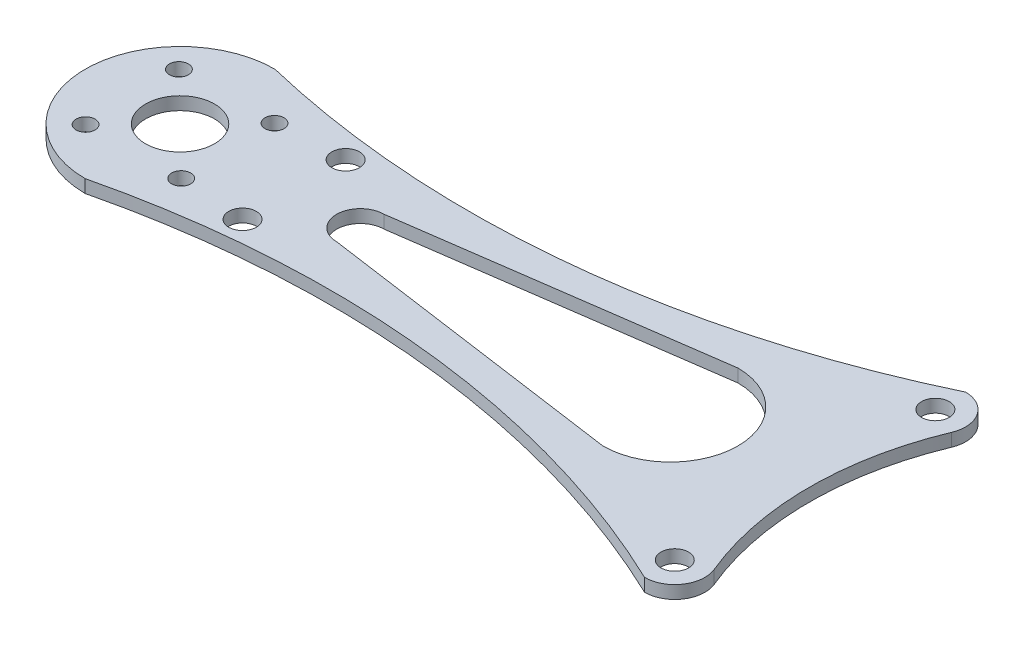
ISO-10303-21;
HEADER;
FILE_DESCRIPTION(('STEP AP214'),'2;1');
FILE_NAME('part.step','',(''),(''),'','','');
FILE_SCHEMA(('AUTOMOTIVE_DESIGN { 1 0 10303 214 1 1 1 1 }'));
ENDSEC;
DATA;
#1=APPLICATION_CONTEXT('core data for automotive mechanical design processes');
#2=APPLICATION_PROTOCOL_DEFINITION('international standard','automotive_design',2000,#1);
#3=PRODUCT_CONTEXT('',#1,'mechanical');
#4=PRODUCT('Part','Part','',(#3));
#5=PRODUCT_RELATED_PRODUCT_CATEGORY('part','',(#4));
#6=PRODUCT_DEFINITION_FORMATION('','',#4);
#7=PRODUCT_DEFINITION_CONTEXT('part definition',#1,'design');
#8=PRODUCT_DEFINITION('design','',#6,#7);
#9=PRODUCT_DEFINITION_SHAPE('','',#8);
#10=(LENGTH_UNIT() NAMED_UNIT(*) SI_UNIT(.MILLI.,.METRE.));
#11=(NAMED_UNIT(*) PLANE_ANGLE_UNIT() SI_UNIT($,.RADIAN.));
#12=(NAMED_UNIT(*) SI_UNIT($,.STERADIAN.) SOLID_ANGLE_UNIT());
#13=UNCERTAINTY_MEASURE_WITH_UNIT(LENGTH_MEASURE(1.E-05),#10,'distance_accuracy_value','');
#14=(GEOMETRIC_REPRESENTATION_CONTEXT(3) GLOBAL_UNCERTAINTY_ASSIGNED_CONTEXT((#13)) GLOBAL_UNIT_ASSIGNED_CONTEXT((#10,
#11,#12)) REPRESENTATION_CONTEXT('',''));
#15=CARTESIAN_POINT('',(0.,0.,0.));
#16=DIRECTION('',(0.,0.,1.));
#17=DIRECTION('',(1.,0.,0.));
#18=AXIS2_PLACEMENT_3D('',#15,#16,#17);
#19=CARTESIAN_POINT('',(-18.246620767098,0.75,7.55799778921041));
#20=DIRECTION('',(0.,1.,0.));
#21=DIRECTION('',(0.,0.,1.));
#22=AXIS2_PLACEMENT_3D('',#19,#20,#21);
#23=PLANE('',#22);
#24=CARTESIAN_POINT('',(-114.54591161256,0.75,-5.41344293270639));
#25=DIRECTION('',(0.,1.,0.));
#26=DIRECTION('',(0.,0.,1.));
#27=AXIS2_PLACEMENT_3D('',#24,#25,#26);
#28=CIRCLE('',#27,1.10000000000002);
#29=CARTESIAN_POINT('',(-114.54591161256,0.75,-4.31344293270637));
#30=VERTEX_POINT('',#29);
#31=EDGE_CURVE('E312',#30,#30,#28,.T.);
#32=ORIENTED_EDGE('',*,*,#31,.F.);
#33=EDGE_LOOP('',(#32));
#34=FACE_BOUND('',#33,.T.);
#35=CARTESIAN_POINT('',(-114.413442932706,0.75,5.54591161256024));
#36=DIRECTION('',(0.,1.,0.));
#37=DIRECTION('',(0.,0.,1.));
#38=AXIS2_PLACEMENT_3D('',#35,#36,#37);
#39=CIRCLE('',#38,1.10000000000001);
#40=CARTESIAN_POINT('',(-114.413442932706,0.75,6.64591161256025));
#41=VERTEX_POINT('',#40);
#42=EDGE_CURVE('E316',#41,#41,#39,.T.);
#43=ORIENTED_EDGE('',*,*,#42,.F.);
#44=EDGE_LOOP('',(#43));
#45=FACE_BOUND('',#44,.T.);
#46=CARTESIAN_POINT('',(-103.45408838744,0.75,5.41344293270657));
#47=DIRECTION('',(0.,1.,0.));
#48=DIRECTION('',(0.,0.,1.));
#49=AXIS2_PLACEMENT_3D('',#46,#47,#48);
#50=CIRCLE('',#49,1.1);
#51=CARTESIAN_POINT('',(-103.45408838744,0.75,6.51344293270658));
#52=VERTEX_POINT('',#51);
#53=EDGE_CURVE('E325',#52,#52,#50,.T.);
#54=ORIENTED_EDGE('',*,*,#53,.F.);
#55=EDGE_LOOP('',(#54));
#56=FACE_BOUND('',#55,.T.);
#57=CARTESIAN_POINT('',(-103.586557067293,0.75,-5.54591161256014));
#58=DIRECTION('',(0.,1.,0.));
#59=DIRECTION('',(0.,0.,1.));
#60=AXIS2_PLACEMENT_3D('',#57,#58,#59);
#61=CIRCLE('',#60,1.10000000000001);
#62=CARTESIAN_POINT('',(-103.586557067293,0.75,-4.44591161256013));
#63=VERTEX_POINT('',#62);
#64=EDGE_CURVE('E331',#63,#63,#61,.T.);
#65=ORIENTED_EDGE('',*,*,#64,.F.);
#66=EDGE_LOOP('',(#65));
#67=FACE_BOUND('',#66,.T.);
#68=CARTESIAN_POINT('',(-88.0784459485142,0.75,0.));
#69=DIRECTION('',(0.,1.,0.));
#70=DIRECTION('',(0.,0.,1.));
#71=AXIS2_PLACEMENT_3D('',#68,#69,#70);
#72=CIRCLE('',#71,2.75757742414673);
#73=CARTESIAN_POINT('',(-88.0784459485142,0.75,-2.75757742414675));
#74=VERTEX_POINT('',#73);
#75=CARTESIAN_POINT('',(-88.0784459485142,0.75,2.75757742414671));
#76=VERTEX_POINT('',#75);
#77=EDGE_CURVE('E48',#74,#76,#72,.T.);
#78=ORIENTED_EDGE('',*,*,#77,.F.);
#79=DIRECTION('',(-0.990191024034519,0.,0.139720205845361));
#80=VECTOR('',#79,1.);
#81=CARTESIAN_POINT('',(-88.0784459485142,0.75,-2.75757742414675));
#82=LINE('',#81,#80);
#83=CARTESIAN_POINT('',(-52.1196363376409,0.75,-7.83151988457672));
#84=VERTEX_POINT('',#83);
#85=EDGE_CURVE('E118',#84,#74,#82,.T.);
#86=ORIENTED_EDGE('',*,*,#85,.F.);
#87=CARTESIAN_POINT('',(-52.1196363376409,0.75,0.));
#88=DIRECTION('',(0.,1.,0.));
#89=DIRECTION('',(0.,0.,1.));
#90=AXIS2_PLACEMENT_3D('',#87,#88,#89);
#91=CIRCLE('',#90,7.8315198845767);
#92=CARTESIAN_POINT('',(-52.1196363376409,0.75,7.83151988457668));
#93=VERTEX_POINT('',#92);
#94=EDGE_CURVE('E138',#93,#84,#91,.T.);
#95=ORIENTED_EDGE('',*,*,#94,.F.);
#96=DIRECTION('',(0.990191024034519,0.,0.139720205845361));
#97=VECTOR('',#96,1.);
#98=CARTESIAN_POINT('',(-88.0784459485142,0.75,2.75757742414671));
#99=LINE('',#98,#97);
#100=EDGE_CURVE('E132',#76,#93,#99,.T.);
#101=ORIENTED_EDGE('',*,*,#100,.F.);
#102=EDGE_LOOP('',(#78,#86,#95,#101));
#103=FACE_BOUND('',#102,.T.);
#104=CARTESIAN_POINT('',(-109.,0.75,0.));
#105=DIRECTION('',(0.,1.,0.));
#106=DIRECTION('',(0.,0.,1.));
#107=AXIS2_PLACEMENT_3D('',#104,#105,#106);
#108=CIRCLE('',#107,4.00000000000001);
#109=CARTESIAN_POINT('',(-109.,0.75,4.00000000000001));
#110=VERTEX_POINT('',#109);
#111=EDGE_CURVE('E124',#110,#110,#108,.T.);
#112=ORIENTED_EDGE('',*,*,#111,.F.);
#113=EDGE_LOOP('',(#112));
#114=FACE_BOUND('',#113,.T.);
#115=CARTESIAN_POINT('',(-95.79,0.75,5.96));
#116=DIRECTION('',(0.,1.,0.));
#117=DIRECTION('',(0.,0.,1.));
#118=AXIS2_PLACEMENT_3D('',#115,#116,#117);
#119=CIRCLE('',#118,1.60000000000001);
#120=CARTESIAN_POINT('',(-95.79,0.75,7.56));
#121=VERTEX_POINT('',#120);
#122=EDGE_CURVE('E159',#121,#121,#119,.T.);
#123=ORIENTED_EDGE('',*,*,#122,.F.);
#124=EDGE_LOOP('',(#123));
#125=FACE_BOUND('',#124,.T.);
#126=CARTESIAN_POINT('',(-36.4932415341959,0.75,-15.1159955784208));
#127=DIRECTION('',(0.,1.,0.));
#128=DIRECTION('',(0.,0.,1.));
#129=AXIS2_PLACEMENT_3D('',#126,#127,#128);
#130=CIRCLE('',#129,1.6);
#131=CARTESIAN_POINT('',(-36.4932415341959,0.75,-13.5159955784208));
#132=VERTEX_POINT('',#131);
#133=EDGE_CURVE('E171',#132,#132,#130,.T.);
#134=ORIENTED_EDGE('',*,*,#133,.F.);
#135=EDGE_LOOP('',(#134));
#136=FACE_BOUND('',#135,.T.);
#137=CARTESIAN_POINT('',(-36.4932415341959,0.75,15.1159955784208));
#138=DIRECTION('',(0.,1.,0.));
#139=DIRECTION('',(0.,0.,1.));
#140=AXIS2_PLACEMENT_3D('',#137,#138,#139);
#141=CIRCLE('',#140,3.50000000000001);
#142=CARTESIAN_POINT('',(-36.4932415341959,0.75,18.6159955784208));
#143=VERTEX_POINT('',#142);
#144=CARTESIAN_POINT('',(-33.2596631704064,0.75,13.776603565143));
#145=VERTEX_POINT('',#144);
#146=EDGE_CURVE('E177',#143,#145,#141,.T.);
#147=ORIENTED_EDGE('',*,*,#146,.T.);
#148=CARTESIAN_POINT('',(0.,0.75,0.));
#149=DIRECTION('',(0.,-1.,0.));
#150=DIRECTION('',(0.,0.,1.));
#151=AXIS2_PLACEMENT_3D('',#148,#149,#150);
#152=CIRCLE('',#151,36.);
#153=CARTESIAN_POINT('',(-33.2596631704064,0.75,-13.776603565143));
#154=VERTEX_POINT('',#153);
#155=EDGE_CURVE('E180',#145,#154,#152,.T.);
#156=ORIENTED_EDGE('',*,*,#155,.T.);
#157=CARTESIAN_POINT('',(-36.4932415341959,0.75,-15.1159955784208));
#158=DIRECTION('',(0.,1.,0.));
#159=DIRECTION('',(0.,0.,1.));
#160=AXIS2_PLACEMENT_3D('',#157,#158,#159);
#161=CIRCLE('',#160,3.5);
#162=CARTESIAN_POINT('',(-36.4932415341959,0.75,-18.6159955784208));
#163=VERTEX_POINT('',#162);
#164=EDGE_CURVE('E183',#154,#163,#161,.T.);
#165=ORIENTED_EDGE('',*,*,#164,.T.);
#166=CARTESIAN_POINT('',(-83.4775380681395,0.75,-116.969825596425));
#167=DIRECTION('',(0.,-1.,0.));
#168=DIRECTION('',(0.,0.,1.));
#169=AXIS2_PLACEMENT_3D('',#166,#167,#168);
#170=CIRCLE('',#169,109.);
#171=CARTESIAN_POINT('',(-109.,0.75,-11.));
#172=VERTEX_POINT('',#171);
#173=EDGE_CURVE('E185',#163,#172,#170,.T.);
#174=ORIENTED_EDGE('',*,*,#173,.T.);
#175=CARTESIAN_POINT('',(-109.,0.75,0.));
#176=DIRECTION('',(0.,1.,0.));
#177=DIRECTION('',(0.,0.,1.));
#178=AXIS2_PLACEMENT_3D('',#175,#176,#177);
#179=CIRCLE('',#178,11.);
#180=CARTESIAN_POINT('',(-109.,0.75,11.));
#181=VERTEX_POINT('',#180);
#182=EDGE_CURVE('E187',#172,#181,#179,.T.);
#183=ORIENTED_EDGE('',*,*,#182,.T.);
#184=CARTESIAN_POINT('',(-83.4775380681395,0.75,116.969825596425));
#185=DIRECTION('',(0.,-1.,0.));
#186=DIRECTION('',(0.,0.,-1.));
#187=AXIS2_PLACEMENT_3D('',#184,#185,#186);
#188=CIRCLE('',#187,109.);
#189=EDGE_CURVE('E189',#181,#143,#188,.T.);
#190=ORIENTED_EDGE('',*,*,#189,.T.);
#191=EDGE_LOOP('',(#147,#156,#165,#174,#183,#190));
#192=FACE_BOUND('',#191,.T.);
#193=CARTESIAN_POINT('',(-36.4932415341959,0.75,15.1159955784208));
#194=DIRECTION('',(0.,1.,0.));
#195=DIRECTION('',(0.,0.,1.));
#196=AXIS2_PLACEMENT_3D('',#193,#194,#195);
#197=CIRCLE('',#196,1.6);
#198=CARTESIAN_POINT('',(-36.4932415341959,0.75,16.7159955784208));
#199=VERTEX_POINT('',#198);
#200=EDGE_CURVE('E165',#199,#199,#197,.T.);
#201=ORIENTED_EDGE('',*,*,#200,.F.);
#202=EDGE_LOOP('',(#201));
#203=FACE_BOUND('',#202,.T.);
#204=CARTESIAN_POINT('',(-95.79,0.75,-6.));
#205=DIRECTION('',(0.,1.,0.));
#206=DIRECTION('',(0.,0.,1.));
#207=AXIS2_PLACEMENT_3D('',#204,#205,#206);
#208=CIRCLE('',#207,1.60000000000001);
#209=CARTESIAN_POINT('',(-95.79,0.75,-4.4));
#210=VERTEX_POINT('',#209);
#211=EDGE_CURVE('E153',#210,#210,#208,.T.);
#212=ORIENTED_EDGE('',*,*,#211,.F.);
#213=EDGE_LOOP('',(#212));
#214=FACE_BOUND('',#213,.T.);
#215=ADVANCED_FACE('F33',(#34,#45,#56,#67,#103,#114,#125,#136,#192,#203,#214),#23,.T.);
#216=CARTESIAN_POINT('',(-18.246620767098,-0.75,7.55799778921041));
#217=DIRECTION('',(0.,1.,0.));
#218=DIRECTION('',(0.,0.,1.));
#219=AXIS2_PLACEMENT_3D('',#216,#217,#218);
#220=PLANE('',#219);
#221=CARTESIAN_POINT('',(-114.54591161256,-0.75,-5.41344293270639));
#222=DIRECTION('',(0.,1.,0.));
#223=DIRECTION('',(0.,0.,1.));
#224=AXIS2_PLACEMENT_3D('',#221,#222,#223);
#225=CIRCLE('',#224,1.10000000000002);
#226=CARTESIAN_POINT('',(-114.54591161256,-0.75,-4.31344293270637));
#227=VERTEX_POINT('',#226);
#228=EDGE_CURVE('E315',#227,#227,#225,.F.);
#229=ORIENTED_EDGE('',*,*,#228,.F.);
#230=EDGE_LOOP('',(#229));
#231=FACE_BOUND('',#230,.T.);
#232=CARTESIAN_POINT('',(-114.413442932706,-0.75,5.54591161256024));
#233=DIRECTION('',(0.,1.,0.));
#234=DIRECTION('',(0.,0.,1.));
#235=AXIS2_PLACEMENT_3D('',#232,#233,#234);
#236=CIRCLE('',#235,1.10000000000001);
#237=CARTESIAN_POINT('',(-114.413442932706,-0.75,6.64591161256025));
#238=VERTEX_POINT('',#237);
#239=EDGE_CURVE('E319',#238,#238,#236,.F.);
#240=ORIENTED_EDGE('',*,*,#239,.F.);
#241=EDGE_LOOP('',(#240));
#242=FACE_BOUND('',#241,.T.);
#243=CARTESIAN_POINT('',(-103.45408838744,-0.75,5.41344293270657));
#244=DIRECTION('',(0.,1.,0.));
#245=DIRECTION('',(0.,0.,1.));
#246=AXIS2_PLACEMENT_3D('',#243,#244,#245);
#247=CIRCLE('',#246,1.1);
#248=CARTESIAN_POINT('',(-103.45408838744,-0.75,6.51344293270658));
#249=VERTEX_POINT('',#248);
#250=EDGE_CURVE('E328',#249,#249,#247,.F.);
#251=ORIENTED_EDGE('',*,*,#250,.F.);
#252=EDGE_LOOP('',(#251));
#253=FACE_BOUND('',#252,.T.);
#254=CARTESIAN_POINT('',(-103.586557067293,-0.75,-5.54591161256014));
#255=DIRECTION('',(0.,1.,0.));
#256=DIRECTION('',(0.,0.,1.));
#257=AXIS2_PLACEMENT_3D('',#254,#255,#256);
#258=CIRCLE('',#257,1.10000000000001);
#259=CARTESIAN_POINT('',(-103.586557067293,-0.75,-4.44591161256013));
#260=VERTEX_POINT('',#259);
#261=EDGE_CURVE('E334',#260,#260,#258,.F.);
#262=ORIENTED_EDGE('',*,*,#261,.F.);
#263=EDGE_LOOP('',(#262));
#264=FACE_BOUND('',#263,.T.);
#265=DIRECTION('',(0.990191024034519,0.,-0.139720205845361));
#266=VECTOR('',#265,1.);
#267=CARTESIAN_POINT('',(-88.0784459485142,-0.75,-2.75757742414675));
#268=LINE('',#267,#266);
#269=CARTESIAN_POINT('',(-88.0784459485142,-0.75,-2.75757742414675));
#270=VERTEX_POINT('',#269);
#271=CARTESIAN_POINT('',(-52.1196363376409,-0.75,-7.83151988457672));
#272=VERTEX_POINT('',#271);
#273=EDGE_CURVE('E130',#270,#272,#268,.T.);
#274=ORIENTED_EDGE('',*,*,#273,.F.);
#275=CARTESIAN_POINT('',(-88.0784459485142,-0.75,0.));
#276=DIRECTION('',(0.,1.,0.));
#277=DIRECTION('',(0.,0.,1.));
#278=AXIS2_PLACEMENT_3D('',#275,#276,#277);
#279=CIRCLE('',#278,2.75757742414673);
#280=CARTESIAN_POINT('',(-88.0784459485142,-0.75,2.75757742414671));
#281=VERTEX_POINT('',#280);
#282=EDGE_CURVE('E112',#281,#270,#279,.F.);
#283=ORIENTED_EDGE('',*,*,#282,.F.);
#284=DIRECTION('',(-0.990191024034519,0.,-0.139720205845361));
#285=VECTOR('',#284,1.);
#286=CARTESIAN_POINT('',(-88.0784459485142,-0.75,2.75757742414671));
#287=LINE('',#286,#285);
#288=CARTESIAN_POINT('',(-52.1196363376409,-0.75,7.83151988457668));
#289=VERTEX_POINT('',#288);
#290=EDGE_CURVE('E121',#289,#281,#287,.T.);
#291=ORIENTED_EDGE('',*,*,#290,.F.);
#292=CARTESIAN_POINT('',(-52.1196363376409,-0.75,0.));
#293=DIRECTION('',(0.,1.,0.));
#294=DIRECTION('',(0.,0.,1.));
#295=AXIS2_PLACEMENT_3D('',#292,#293,#294);
#296=CIRCLE('',#295,7.8315198845767);
#297=EDGE_CURVE('E56',#272,#289,#296,.F.);
#298=ORIENTED_EDGE('',*,*,#297,.F.);
#299=EDGE_LOOP('',(#274,#283,#291,#298));
#300=FACE_BOUND('',#299,.T.);
#301=CARTESIAN_POINT('',(-109.,-0.75,0.));
#302=DIRECTION('',(0.,1.,0.));
#303=DIRECTION('',(0.,0.,1.));
#304=AXIS2_PLACEMENT_3D('',#301,#302,#303);
#305=CIRCLE('',#304,4.00000000000001);
#306=CARTESIAN_POINT('',(-109.,-0.75,4.00000000000001));
#307=VERTEX_POINT('',#306);
#308=EDGE_CURVE('E149',#307,#307,#305,.F.);
#309=ORIENTED_EDGE('',*,*,#308,.F.);
#310=EDGE_LOOP('',(#309));
#311=FACE_BOUND('',#310,.T.);
#312=CARTESIAN_POINT('',(-95.79,-0.75,5.96));
#313=DIRECTION('',(0.,1.,0.));
#314=DIRECTION('',(0.,0.,1.));
#315=AXIS2_PLACEMENT_3D('',#312,#313,#314);
#316=CIRCLE('',#315,1.60000000000001);
#317=CARTESIAN_POINT('',(-95.79,-0.75,7.56));
#318=VERTEX_POINT('',#317);
#319=EDGE_CURVE('E156',#318,#318,#316,.T.);
#320=ORIENTED_EDGE('',*,*,#319,.T.);
#321=EDGE_LOOP('',(#320));
#322=FACE_BOUND('',#321,.T.);
#323=CARTESIAN_POINT('',(-36.4932415341959,-0.75,-15.1159955784208));
#324=DIRECTION('',(0.,1.,0.));
#325=DIRECTION('',(0.,0.,1.));
#326=AXIS2_PLACEMENT_3D('',#323,#324,#325);
#327=CIRCLE('',#326,1.6);
#328=CARTESIAN_POINT('',(-36.4932415341959,-0.75,-13.5159955784208));
#329=VERTEX_POINT('',#328);
#330=EDGE_CURVE('E168',#329,#329,#327,.T.);
#331=ORIENTED_EDGE('',*,*,#330,.T.);
#332=EDGE_LOOP('',(#331));
#333=FACE_BOUND('',#332,.T.);
#334=CARTESIAN_POINT('',(-36.4932415341959,-0.75,15.1159955784208));
#335=DIRECTION('',(0.,1.,0.));
#336=DIRECTION('',(0.,0.,1.));
#337=AXIS2_PLACEMENT_3D('',#334,#335,#336);
#338=CIRCLE('',#337,3.50000000000001);
#339=CARTESIAN_POINT('',(-36.4932415341959,-0.75,18.6159955784208));
#340=VERTEX_POINT('',#339);
#341=CARTESIAN_POINT('',(-33.2596631704064,-0.75,13.776603565143));
#342=VERTEX_POINT('',#341);
#343=EDGE_CURVE('E174',#340,#342,#338,.T.);
#344=ORIENTED_EDGE('',*,*,#343,.F.);
#345=CARTESIAN_POINT('',(-83.4775380681395,-0.75,116.969825596425));
#346=DIRECTION('',(0.,-1.,0.));
#347=DIRECTION('',(0.,0.,-1.));
#348=AXIS2_PLACEMENT_3D('',#345,#346,#347);
#349=CIRCLE('',#348,109.);
#350=CARTESIAN_POINT('',(-109.,-0.75,11.));
#351=VERTEX_POINT('',#350);
#352=EDGE_CURVE('E181',#351,#340,#349,.T.);
#353=ORIENTED_EDGE('',*,*,#352,.F.);
#354=CARTESIAN_POINT('',(-109.,-0.75,0.));
#355=DIRECTION('',(0.,1.,0.));
#356=DIRECTION('',(0.,0.,1.));
#357=AXIS2_PLACEMENT_3D('',#354,#355,#356);
#358=CIRCLE('',#357,11.);
#359=CARTESIAN_POINT('',(-109.,-0.75,-11.));
#360=VERTEX_POINT('',#359);
#361=EDGE_CURVE('E200',#360,#351,#358,.T.);
#362=ORIENTED_EDGE('',*,*,#361,.F.);
#363=CARTESIAN_POINT('',(-83.4775380681395,-0.75,-116.969825596425));
#364=DIRECTION('',(0.,-1.,0.));
#365=DIRECTION('',(0.,0.,1.));
#366=AXIS2_PLACEMENT_3D('',#363,#364,#365);
#367=CIRCLE('',#366,109.);
#368=CARTESIAN_POINT('',(-36.4932415341959,-0.75,-18.6159955784208));
#369=VERTEX_POINT('',#368);
#370=EDGE_CURVE('E198',#369,#360,#367,.T.);
#371=ORIENTED_EDGE('',*,*,#370,.F.);
#372=CARTESIAN_POINT('',(-36.4932415341959,-0.75,-15.1159955784208));
#373=DIRECTION('',(0.,1.,0.));
#374=DIRECTION('',(0.,0.,1.));
#375=AXIS2_PLACEMENT_3D('',#372,#373,#374);
#376=CIRCLE('',#375,3.5);
#377=CARTESIAN_POINT('',(-33.2596631704064,-0.75,-13.776603565143));
#378=VERTEX_POINT('',#377);
#379=EDGE_CURVE('E196',#378,#369,#376,.T.);
#380=ORIENTED_EDGE('',*,*,#379,.F.);
#381=CARTESIAN_POINT('',(0.,-0.75,0.));
#382=DIRECTION('',(0.,-1.,0.));
#383=DIRECTION('',(0.,0.,1.));
#384=AXIS2_PLACEMENT_3D('',#381,#382,#383);
#385=CIRCLE('',#384,36.);
#386=EDGE_CURVE('E194',#342,#378,#385,.T.);
#387=ORIENTED_EDGE('',*,*,#386,.F.);
#388=EDGE_LOOP('',(#344,#353,#362,#371,#380,#387));
#389=FACE_BOUND('',#388,.T.);
#390=CARTESIAN_POINT('',(-36.4932415341959,-0.75,15.1159955784208));
#391=DIRECTION('',(0.,1.,0.));
#392=DIRECTION('',(0.,0.,1.));
#393=AXIS2_PLACEMENT_3D('',#390,#391,#392);
#394=CIRCLE('',#393,1.6);
#395=CARTESIAN_POINT('',(-36.4932415341959,-0.75,16.7159955784208));
#396=VERTEX_POINT('',#395);
#397=EDGE_CURVE('E162',#396,#396,#394,.T.);
#398=ORIENTED_EDGE('',*,*,#397,.T.);
#399=EDGE_LOOP('',(#398));
#400=FACE_BOUND('',#399,.T.);
#401=CARTESIAN_POINT('',(-95.79,-0.75,-6.));
#402=DIRECTION('',(0.,1.,0.));
#403=DIRECTION('',(0.,0.,1.));
#404=AXIS2_PLACEMENT_3D('',#401,#402,#403);
#405=CIRCLE('',#404,1.60000000000001);
#406=CARTESIAN_POINT('',(-95.79,-0.75,-4.4));
#407=VERTEX_POINT('',#406);
#408=EDGE_CURVE('E152',#407,#407,#405,.T.);
#409=ORIENTED_EDGE('',*,*,#408,.T.);
#410=EDGE_LOOP('',(#409));
#411=FACE_BOUND('',#410,.T.);
#412=ADVANCED_FACE('F127',(#231,#242,#253,#264,#300,#311,#322,#333,#389,#400,#411),#220,.F.);
#413=CARTESIAN_POINT('',(-36.4932415341959,0.75,15.1159955784208));
#414=DIRECTION('',(0.,-1.,0.));
#415=DIRECTION('',(0.,0.,-1.));
#416=AXIS2_PLACEMENT_3D('',#413,#414,#415);
#417=CYLINDRICAL_SURFACE('',#416,3.50000000000001);
#418=ORIENTED_EDGE('',*,*,#343,.T.);
#419=DIRECTION('',(0.,-1.,0.));
#420=VECTOR('',#419,1.);
#421=CARTESIAN_POINT('',(-33.2596631704064,0.75,13.776603565143));
#422=LINE('',#421,#420);
#423=EDGE_CURVE('E11',#145,#342,#422,.T.);
#424=ORIENTED_EDGE('',*,*,#423,.F.);
#425=ORIENTED_EDGE('',*,*,#146,.F.);
#426=DIRECTION('',(0.,-1.,0.));
#427=VECTOR('',#426,1.);
#428=CARTESIAN_POINT('',(-36.4932415341959,0.75,18.6159955784208));
#429=LINE('',#428,#427);
#430=EDGE_CURVE('E191',#143,#340,#429,.T.);
#431=ORIENTED_EDGE('',*,*,#430,.T.);
#432=EDGE_LOOP('',(#418,#424,#425,#431));
#433=FACE_BOUND('',#432,.T.);
#434=ADVANCED_FACE('F35',(#433),#417,.T.);
#435=CARTESIAN_POINT('',(0.,0.75,0.));
#436=DIRECTION('',(0.,-1.,0.));
#437=DIRECTION('',(0.,0.,-1.));
#438=AXIS2_PLACEMENT_3D('',#435,#436,#437);
#439=CYLINDRICAL_SURFACE('',#438,36.);
#440=ORIENTED_EDGE('',*,*,#386,.T.);
#441=DIRECTION('',(0.,-1.,0.));
#442=VECTOR('',#441,1.);
#443=CARTESIAN_POINT('',(-33.2596631704064,0.75,-13.776603565143));
#444=LINE('',#443,#442);
#445=EDGE_CURVE('E41',#154,#378,#444,.T.);
#446=ORIENTED_EDGE('',*,*,#445,.F.);
#447=ORIENTED_EDGE('',*,*,#155,.F.);
#448=ORIENTED_EDGE('',*,*,#423,.T.);
#449=EDGE_LOOP('',(#440,#446,#447,#448));
#450=FACE_BOUND('',#449,.T.);
#451=ADVANCED_FACE('F241',(#450),#439,.F.);
#452=CARTESIAN_POINT('',(-36.4932415341959,0.75,-15.1159955784208));
#453=DIRECTION('',(0.,-1.,0.));
#454=DIRECTION('',(0.,0.,-1.));
#455=AXIS2_PLACEMENT_3D('',#452,#453,#454);
#456=CYLINDRICAL_SURFACE('',#455,3.5);
#457=ORIENTED_EDGE('',*,*,#379,.T.);
#458=DIRECTION('',(0.,-1.,0.));
#459=VECTOR('',#458,1.);
#460=CARTESIAN_POINT('',(-36.4932415341959,0.75,-18.6159955784208));
#461=LINE('',#460,#459);
#462=EDGE_CURVE('E211',#163,#369,#461,.T.);
#463=ORIENTED_EDGE('',*,*,#462,.F.);
#464=ORIENTED_EDGE('',*,*,#164,.F.);
#465=ORIENTED_EDGE('',*,*,#445,.T.);
#466=EDGE_LOOP('',(#457,#463,#464,#465));
#467=FACE_BOUND('',#466,.T.);
#468=ADVANCED_FACE('F218',(#467),#456,.T.);
#469=CARTESIAN_POINT('',(-83.4775380681395,0.75,-116.969825596425));
#470=DIRECTION('',(0.,-1.,0.));
#471=DIRECTION('',(0.,0.,-1.));
#472=AXIS2_PLACEMENT_3D('',#469,#470,#471);
#473=CYLINDRICAL_SURFACE('',#472,109.);
#474=ORIENTED_EDGE('',*,*,#370,.T.);
#475=DIRECTION('',(0.,-1.,0.));
#476=VECTOR('',#475,1.);
#477=CARTESIAN_POINT('',(-109.,0.75,-11.));
#478=LINE('',#477,#476);
#479=EDGE_CURVE('E208',#172,#360,#478,.T.);
#480=ORIENTED_EDGE('',*,*,#479,.F.);
#481=ORIENTED_EDGE('',*,*,#173,.F.);
#482=ORIENTED_EDGE('',*,*,#462,.T.);
#483=EDGE_LOOP('',(#474,#480,#481,#482));
#484=FACE_BOUND('',#483,.T.);
#485=ADVANCED_FACE('F229',(#484),#473,.F.);
#486=CARTESIAN_POINT('',(-109.,0.75,0.));
#487=DIRECTION('',(0.,-1.,0.));
#488=DIRECTION('',(0.,0.,-1.));
#489=AXIS2_PLACEMENT_3D('',#486,#487,#488);
#490=CYLINDRICAL_SURFACE('',#489,11.);
#491=ORIENTED_EDGE('',*,*,#361,.T.);
#492=DIRECTION('',(0.,-1.,0.));
#493=VECTOR('',#492,1.);
#494=CARTESIAN_POINT('',(-109.,0.75,11.));
#495=LINE('',#494,#493);
#496=EDGE_CURVE('E205',#181,#351,#495,.T.);
#497=ORIENTED_EDGE('',*,*,#496,.F.);
#498=ORIENTED_EDGE('',*,*,#182,.F.);
#499=ORIENTED_EDGE('',*,*,#479,.T.);
#500=EDGE_LOOP('',(#491,#497,#498,#499));
#501=FACE_BOUND('',#500,.T.);
#502=ADVANCED_FACE('F233',(#501),#490,.T.);
#503=CARTESIAN_POINT('',(-83.4775380681395,0.75,116.969825596425));
#504=DIRECTION('',(0.,-1.,0.));
#505=DIRECTION('',(0.,0.,-1.));
#506=AXIS2_PLACEMENT_3D('',#503,#504,#505);
#507=CYLINDRICAL_SURFACE('',#506,109.);
#508=ORIENTED_EDGE('',*,*,#352,.T.);
#509=ORIENTED_EDGE('',*,*,#430,.F.);
#510=ORIENTED_EDGE('',*,*,#189,.F.);
#511=ORIENTED_EDGE('',*,*,#496,.T.);
#512=EDGE_LOOP('',(#508,#509,#510,#511));
#513=FACE_BOUND('',#512,.T.);
#514=ADVANCED_FACE('F244',(#513),#507,.F.);
#515=CARTESIAN_POINT('',(-36.4932415341959,0.75,-15.1159955784208));
#516=DIRECTION('',(0.,-1.,0.));
#517=DIRECTION('',(0.,0.,-1.));
#518=AXIS2_PLACEMENT_3D('',#515,#516,#517);
#519=CYLINDRICAL_SURFACE('',#518,1.6);
#520=ORIENTED_EDGE('',*,*,#133,.T.);
#521=EDGE_LOOP('',(#520));
#522=FACE_BOUND('',#521,.T.);
#523=ORIENTED_EDGE('',*,*,#330,.F.);
#524=EDGE_LOOP('',(#523));
#525=FACE_BOUND('',#524,.T.);
#526=ADVANCED_FACE('F246',(#522,#525),#519,.F.);
#527=CARTESIAN_POINT('',(-36.4932415341959,0.75,15.1159955784208));
#528=DIRECTION('',(0.,-1.,0.));
#529=DIRECTION('',(0.,0.,-1.));
#530=AXIS2_PLACEMENT_3D('',#527,#528,#529);
#531=CYLINDRICAL_SURFACE('',#530,1.6);
#532=ORIENTED_EDGE('',*,*,#200,.T.);
#533=EDGE_LOOP('',(#532));
#534=FACE_BOUND('',#533,.T.);
#535=ORIENTED_EDGE('',*,*,#397,.F.);
#536=EDGE_LOOP('',(#535));
#537=FACE_BOUND('',#536,.T.);
#538=ADVANCED_FACE('F252',(#534,#537),#531,.F.);
#539=CARTESIAN_POINT('',(-95.79,0.75,5.96));
#540=DIRECTION('',(0.,-1.,0.));
#541=DIRECTION('',(0.,0.,-1.));
#542=AXIS2_PLACEMENT_3D('',#539,#540,#541);
#543=CYLINDRICAL_SURFACE('',#542,1.60000000000001);
#544=ORIENTED_EDGE('',*,*,#122,.T.);
#545=EDGE_LOOP('',(#544));
#546=FACE_BOUND('',#545,.T.);
#547=ORIENTED_EDGE('',*,*,#319,.F.);
#548=EDGE_LOOP('',(#547));
#549=FACE_BOUND('',#548,.T.);
#550=ADVANCED_FACE('F269',(#546,#549),#543,.F.);
#551=CARTESIAN_POINT('',(-95.79,0.75,-6.));
#552=DIRECTION('',(0.,-1.,0.));
#553=DIRECTION('',(0.,0.,-1.));
#554=AXIS2_PLACEMENT_3D('',#551,#552,#553);
#555=CYLINDRICAL_SURFACE('',#554,1.60000000000001);
#556=ORIENTED_EDGE('',*,*,#211,.T.);
#557=EDGE_LOOP('',(#556));
#558=FACE_BOUND('',#557,.T.);
#559=ORIENTED_EDGE('',*,*,#408,.F.);
#560=EDGE_LOOP('',(#559));
#561=FACE_BOUND('',#560,.T.);
#562=ADVANCED_FACE('F273',(#558,#561),#555,.F.);
#563=CARTESIAN_POINT('',(-109.,-0.751,0.));
#564=DIRECTION('',(0.,1.,0.));
#565=DIRECTION('',(0.,0.,1.));
#566=AXIS2_PLACEMENT_3D('',#563,#564,#565);
#567=CYLINDRICAL_SURFACE('',#566,4.00000000000001);
#568=ORIENTED_EDGE('',*,*,#111,.T.);
#569=EDGE_LOOP('',(#568));
#570=FACE_BOUND('',#569,.T.);
#571=ORIENTED_EDGE('',*,*,#308,.T.);
#572=EDGE_LOOP('',(#571));
#573=FACE_BOUND('',#572,.T.);
#574=ADVANCED_FACE('F277',(#570,#573),#567,.F.);
#575=CARTESIAN_POINT('',(-88.0784459485142,-0.751,0.));
#576=DIRECTION('',(0.,1.,0.));
#577=DIRECTION('',(0.,0.,1.));
#578=AXIS2_PLACEMENT_3D('',#575,#576,#577);
#579=CYLINDRICAL_SURFACE('',#578,2.75757742414673);
#580=ORIENTED_EDGE('',*,*,#282,.T.);
#581=DIRECTION('',(0.,1.,0.));
#582=VECTOR('',#581,1.);
#583=CARTESIAN_POINT('',(-88.0784459485142,-0.751,-2.75757742414675));
#584=LINE('',#583,#582);
#585=EDGE_CURVE('E125',#270,#74,#584,.T.);
#586=ORIENTED_EDGE('',*,*,#585,.T.);
#587=ORIENTED_EDGE('',*,*,#77,.T.);
#588=DIRECTION('',(0.,1.,0.));
#589=VECTOR('',#588,1.);
#590=CARTESIAN_POINT('',(-88.0784459485142,-0.751,2.75757742414671));
#591=LINE('',#590,#589);
#592=EDGE_CURVE('E108',#281,#76,#591,.T.);
#593=ORIENTED_EDGE('',*,*,#592,.F.);
#594=EDGE_LOOP('',(#580,#586,#587,#593));
#595=FACE_BOUND('',#594,.T.);
#596=ADVANCED_FACE('F110',(#595),#579,.F.);
#597=CARTESIAN_POINT('',(-88.0784459485142,-0.751,-2.75757742414675));
#598=DIRECTION('',(-0.139720205845361,0.,-0.990191024034519));
#599=DIRECTION('',(-0.990191024034519,0.,0.139720205845361));
#600=AXIS2_PLACEMENT_3D('',#597,#598,#599);
#601=PLANE('',#600);
#602=ORIENTED_EDGE('',*,*,#273,.T.);
#603=DIRECTION('',(0.,1.,0.));
#604=VECTOR('',#603,1.);
#605=CARTESIAN_POINT('',(-52.1196363376409,-0.751,-7.83151988457672));
#606=LINE('',#605,#604);
#607=EDGE_CURVE('E144',#272,#84,#606,.T.);
#608=ORIENTED_EDGE('',*,*,#607,.T.);
#609=ORIENTED_EDGE('',*,*,#85,.T.);
#610=ORIENTED_EDGE('',*,*,#585,.F.);
#611=EDGE_LOOP('',(#602,#608,#609,#610));
#612=FACE_BOUND('',#611,.T.);
#613=ADVANCED_FACE('F284',(#612),#601,.F.);
#614=CARTESIAN_POINT('',(-52.1196363376409,-0.751,0.));
#615=DIRECTION('',(0.,1.,0.));
#616=DIRECTION('',(0.,0.,1.));
#617=AXIS2_PLACEMENT_3D('',#614,#615,#616);
#618=CYLINDRICAL_SURFACE('',#617,7.8315198845767);
#619=ORIENTED_EDGE('',*,*,#297,.T.);
#620=DIRECTION('',(0.,1.,0.));
#621=VECTOR('',#620,1.);
#622=CARTESIAN_POINT('',(-52.1196363376409,-0.751,7.83151988457668));
#623=LINE('',#622,#621);
#624=EDGE_CURVE('E117',#289,#93,#623,.T.);
#625=ORIENTED_EDGE('',*,*,#624,.T.);
#626=ORIENTED_EDGE('',*,*,#94,.T.);
#627=ORIENTED_EDGE('',*,*,#607,.F.);
#628=EDGE_LOOP('',(#619,#625,#626,#627));
#629=FACE_BOUND('',#628,.T.);
#630=ADVANCED_FACE('F288',(#629),#618,.F.);
#631=CARTESIAN_POINT('',(-88.0784459485142,-0.751,2.75757742414671));
#632=DIRECTION('',(-0.139720205845361,0.,0.990191024034519));
#633=DIRECTION('',(0.990191024034519,0.,0.139720205845361));
#634=AXIS2_PLACEMENT_3D('',#631,#632,#633);
#635=PLANE('',#634);
#636=ORIENTED_EDGE('',*,*,#290,.T.);
#637=ORIENTED_EDGE('',*,*,#592,.T.);
#638=ORIENTED_EDGE('',*,*,#100,.T.);
#639=ORIENTED_EDGE('',*,*,#624,.F.);
#640=EDGE_LOOP('',(#636,#637,#638,#639));
#641=FACE_BOUND('',#640,.T.);
#642=ADVANCED_FACE('F122',(#641),#635,.F.);
#643=CARTESIAN_POINT('',(-103.586557067293,-0.751,-5.54591161256014));
#644=DIRECTION('',(0.,1.,0.));
#645=DIRECTION('',(0.,0.,1.));
#646=AXIS2_PLACEMENT_3D('',#643,#644,#645);
#647=CYLINDRICAL_SURFACE('',#646,1.10000000000001);
#648=ORIENTED_EDGE('',*,*,#64,.T.);
#649=EDGE_LOOP('',(#648));
#650=FACE_BOUND('',#649,.T.);
#651=ORIENTED_EDGE('',*,*,#261,.T.);
#652=EDGE_LOOP('',(#651));
#653=FACE_BOUND('',#652,.T.);
#654=ADVANCED_FACE('F287',(#650,#653),#647,.F.);
#655=CARTESIAN_POINT('',(-103.45408838744,-0.751,5.41344293270657));
#656=DIRECTION('',(0.,1.,0.));
#657=DIRECTION('',(0.,0.,1.));
#658=AXIS2_PLACEMENT_3D('',#655,#656,#657);
#659=CYLINDRICAL_SURFACE('',#658,1.1);
#660=ORIENTED_EDGE('',*,*,#53,.T.);
#661=EDGE_LOOP('',(#660));
#662=FACE_BOUND('',#661,.T.);
#663=ORIENTED_EDGE('',*,*,#250,.T.);
#664=EDGE_LOOP('',(#663));
#665=FACE_BOUND('',#664,.T.);
#666=ADVANCED_FACE('F296',(#662,#665),#659,.F.);
#667=CARTESIAN_POINT('',(-114.413442932706,-0.751,5.54591161256024));
#668=DIRECTION('',(0.,1.,0.));
#669=DIRECTION('',(0.,0.,1.));
#670=AXIS2_PLACEMENT_3D('',#667,#668,#669);
#671=CYLINDRICAL_SURFACE('',#670,1.10000000000001);
#672=ORIENTED_EDGE('',*,*,#42,.T.);
#673=EDGE_LOOP('',(#672));
#674=FACE_BOUND('',#673,.T.);
#675=ORIENTED_EDGE('',*,*,#239,.T.);
#676=EDGE_LOOP('',(#675));
#677=FACE_BOUND('',#676,.T.);
#678=ADVANCED_FACE('F300',(#674,#677),#671,.F.);
#679=CARTESIAN_POINT('',(-114.54591161256,-0.751,-5.41344293270639));
#680=DIRECTION('',(0.,1.,0.));
#681=DIRECTION('',(0.,0.,1.));
#682=AXIS2_PLACEMENT_3D('',#679,#680,#681);
#683=CYLINDRICAL_SURFACE('',#682,1.10000000000002);
#684=ORIENTED_EDGE('',*,*,#31,.T.);
#685=EDGE_LOOP('',(#684));
#686=FACE_BOUND('',#685,.T.);
#687=ORIENTED_EDGE('',*,*,#228,.T.);
#688=EDGE_LOOP('',(#687));
#689=FACE_BOUND('',#688,.T.);
#690=ADVANCED_FACE('F304',(#686,#689),#683,.F.);
#691=CLOSED_SHELL('',(#215,#412,#434,#451,#468,#485,#502,#514,#526,#538,#550,#562,#574,#596,
#613,#630,#642,#654,#666,#678,#690));
#692=MANIFOLD_SOLID_BREP('B2',#691);
#693=ADVANCED_BREP_SHAPE_REPRESENTATION('',(#18,#692),#14);
#694=SHAPE_DEFINITION_REPRESENTATION(#9,#693);
ENDSEC;
END-ISO-10303-21;
